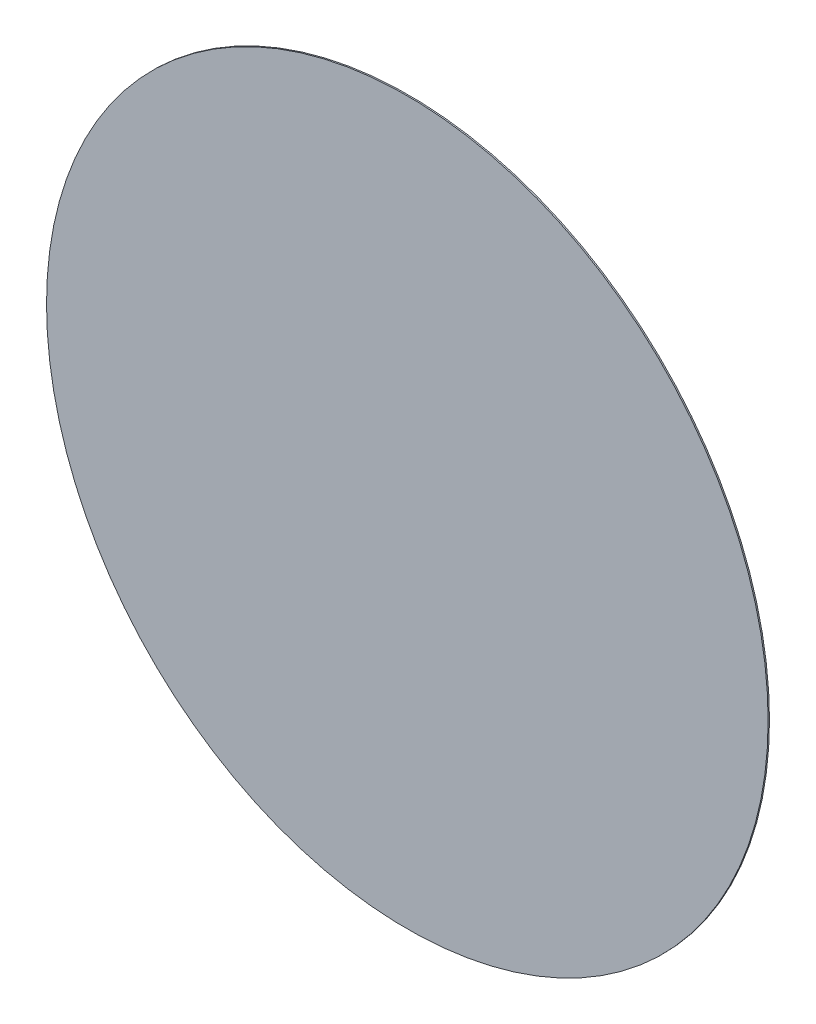
ISO-10303-21;
HEADER;
FILE_DESCRIPTION(('STEP AP214'),'2;1');
FILE_NAME('part.step','',(''),(''),'','','');
FILE_SCHEMA(('AUTOMOTIVE_DESIGN { 1 0 10303 214 1 1 1 1 }'));
ENDSEC;
DATA;
#1=APPLICATION_CONTEXT('core data for automotive mechanical design processes');
#2=APPLICATION_PROTOCOL_DEFINITION('international standard','automotive_design',2000,#1);
#3=PRODUCT_CONTEXT('',#1,'mechanical');
#4=PRODUCT('Part','Part','',(#3));
#5=PRODUCT_RELATED_PRODUCT_CATEGORY('part','',(#4));
#6=PRODUCT_DEFINITION_FORMATION('','',#4);
#7=PRODUCT_DEFINITION_CONTEXT('part definition',#1,'design');
#8=PRODUCT_DEFINITION('design','',#6,#7);
#9=PRODUCT_DEFINITION_SHAPE('','',#8);
#10=(LENGTH_UNIT() NAMED_UNIT(*) SI_UNIT(.MILLI.,.METRE.));
#11=(NAMED_UNIT(*) PLANE_ANGLE_UNIT() SI_UNIT($,.RADIAN.));
#12=(NAMED_UNIT(*) SI_UNIT($,.STERADIAN.) SOLID_ANGLE_UNIT());
#13=UNCERTAINTY_MEASURE_WITH_UNIT(LENGTH_MEASURE(1.E-05),#10,'distance_accuracy_value','');
#14=(GEOMETRIC_REPRESENTATION_CONTEXT(3) GLOBAL_UNCERTAINTY_ASSIGNED_CONTEXT((#13)) GLOBAL_UNIT_ASSIGNED_CONTEXT((#10,
#11,#12)) REPRESENTATION_CONTEXT('',''));
#15=CARTESIAN_POINT('',(0.,0.,0.));
#16=DIRECTION('',(0.,0.,1.));
#17=DIRECTION('',(1.,0.,0.));
#18=AXIS2_PLACEMENT_3D('',#15,#16,#17);
#19=CARTESIAN_POINT('',(0.,0.,0.05));
#20=DIRECTION('',(0.,0.,-1.));
#21=DIRECTION('',(-1.,0.,0.));
#22=AXIS2_PLACEMENT_3D('',#19,#20,#21);
#23=CYLINDRICAL_SURFACE('',#22,13.3);
#24=CARTESIAN_POINT('',(0.,0.,0.05));
#25=DIRECTION('',(0.,0.,1.));
#26=DIRECTION('',(1.,0.,0.));
#27=AXIS2_PLACEMENT_3D('',#24,#25,#26);
#28=CIRCLE('',#27,13.3);
#29=CARTESIAN_POINT('',(13.3,0.,0.05));
#30=VERTEX_POINT('',#29);
#31=EDGE_CURVE('E10',#30,#30,#28,.T.);
#32=ORIENTED_EDGE('',*,*,#31,.F.);
#33=EDGE_LOOP('',(#32));
#34=FACE_BOUND('',#33,.T.);
#35=CARTESIAN_POINT('',(0.,0.,0.));
#36=DIRECTION('',(0.,0.,1.));
#37=DIRECTION('',(1.,0.,0.));
#38=AXIS2_PLACEMENT_3D('',#35,#36,#37);
#39=CIRCLE('',#38,13.3);
#40=CARTESIAN_POINT('',(13.3,0.,0.));
#41=VERTEX_POINT('',#40);
#42=EDGE_CURVE('E37',#41,#41,#39,.T.);
#43=ORIENTED_EDGE('',*,*,#42,.T.);
#44=EDGE_LOOP('',(#43));
#45=FACE_BOUND('',#44,.T.);
#46=ADVANCED_FACE('F40',(#34,#45),#23,.T.);
#47=CARTESIAN_POINT('',(0.,0.,0.05));
#48=DIRECTION('',(0.,0.,1.));
#49=DIRECTION('',(1.,0.,0.));
#50=AXIS2_PLACEMENT_3D('',#47,#48,#49);
#51=PLANE('',#50);
#52=ORIENTED_EDGE('',*,*,#31,.T.);
#53=EDGE_LOOP('',(#52));
#54=FACE_BOUND('',#53,.T.);
#55=ADVANCED_FACE('F55',(#54),#51,.T.);
#56=CARTESIAN_POINT('',(0.,0.,0.));
#57=DIRECTION('',(0.,0.,1.));
#58=DIRECTION('',(1.,0.,0.));
#59=AXIS2_PLACEMENT_3D('',#56,#57,#58);
#60=PLANE('',#59);
#61=ORIENTED_EDGE('',*,*,#42,.F.);
#62=EDGE_LOOP('',(#61));
#63=FACE_BOUND('',#62,.T.);
#64=ADVANCED_FACE('F49',(#63),#60,.F.);
#65=CLOSED_SHELL('',(#46,#55,#64));
#66=MANIFOLD_SOLID_BREP('B2',#65);
#67=ADVANCED_BREP_SHAPE_REPRESENTATION('',(#18,#66),#14);
#68=SHAPE_DEFINITION_REPRESENTATION(#9,#67);
ENDSEC;
END-ISO-10303-21;
